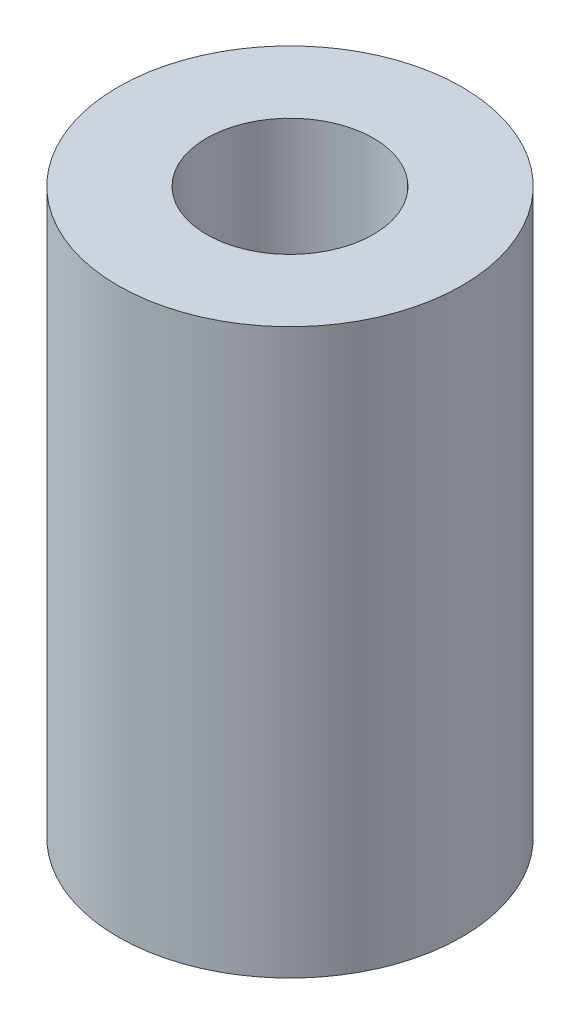
ISO-10303-21;
HEADER;
FILE_DESCRIPTION(('STEP AP214'),'2;1');
FILE_NAME('part.step','',(''),(''),'','','');
FILE_SCHEMA(('AUTOMOTIVE_DESIGN { 1 0 10303 214 1 1 1 1 }'));
ENDSEC;
DATA;
#1=APPLICATION_CONTEXT('core data for automotive mechanical design processes');
#2=APPLICATION_PROTOCOL_DEFINITION('international standard','automotive_design',2000,#1);
#3=PRODUCT_CONTEXT('',#1,'mechanical');
#4=PRODUCT('Part','Part','',(#3));
#5=PRODUCT_RELATED_PRODUCT_CATEGORY('part','',(#4));
#6=PRODUCT_DEFINITION_FORMATION('','',#4);
#7=PRODUCT_DEFINITION_CONTEXT('part definition',#1,'design');
#8=PRODUCT_DEFINITION('design','',#6,#7);
#9=PRODUCT_DEFINITION_SHAPE('','',#8);
#10=(LENGTH_UNIT() NAMED_UNIT(*) SI_UNIT(.MILLI.,.METRE.));
#11=(NAMED_UNIT(*) PLANE_ANGLE_UNIT() SI_UNIT($,.RADIAN.));
#12=(NAMED_UNIT(*) SI_UNIT($,.STERADIAN.) SOLID_ANGLE_UNIT());
#13=UNCERTAINTY_MEASURE_WITH_UNIT(LENGTH_MEASURE(1.E-05),#10,'distance_accuracy_value','');
#14=(GEOMETRIC_REPRESENTATION_CONTEXT(3) GLOBAL_UNCERTAINTY_ASSIGNED_CONTEXT((#13)) GLOBAL_UNIT_ASSIGNED_CONTEXT((#10,
#11,#12)) REPRESENTATION_CONTEXT('',''));
#15=CARTESIAN_POINT('',(0.,0.,0.));
#16=DIRECTION('',(0.,0.,1.));
#17=DIRECTION('',(1.,0.,0.));
#18=AXIS2_PLACEMENT_3D('',#15,#16,#17);
#19=CARTESIAN_POINT('',(0.,0.,0.));
#20=DIRECTION('',(0.,-1.,0.));
#21=DIRECTION('',(0.,0.,-1.));
#22=AXIS2_PLACEMENT_3D('',#19,#20,#21);
#23=CYLINDRICAL_SURFACE('',#22,3.175);
#24=CARTESIAN_POINT('',(0.,-0.326896860986548,0.));
#25=DIRECTION('',(0.,-1.,0.));
#26=DIRECTION('',(0.,0.,-1.));
#27=AXIS2_PLACEMENT_3D('',#24,#25,#26);
#28=CIRCLE('',#27,3.175);
#29=CARTESIAN_POINT('',(0.,-0.326896860986548,-3.175));
#30=VERTEX_POINT('',#29);
#31=EDGE_CURVE('E10',#30,#30,#28,.T.);
#32=ORIENTED_EDGE('',*,*,#31,.F.);
#33=EDGE_LOOP('',(#32));
#34=FACE_BOUND('',#33,.T.);
#35=CARTESIAN_POINT('',(0.,10.0871031390135,0.));
#36=DIRECTION('',(0.,-1.,0.));
#37=DIRECTION('',(0.,0.,-1.));
#38=AXIS2_PLACEMENT_3D('',#35,#36,#37);
#39=CIRCLE('',#38,3.175);
#40=CARTESIAN_POINT('',(0.,10.0871031390135,-3.175));
#41=VERTEX_POINT('',#40);
#42=EDGE_CURVE('E51',#41,#41,#39,.T.);
#43=ORIENTED_EDGE('',*,*,#42,.T.);
#44=EDGE_LOOP('',(#43));
#45=FACE_BOUND('',#44,.T.);
#46=ADVANCED_FACE('F40',(#34,#45),#23,.T.);
#47=CARTESIAN_POINT('',(-3.175,-0.326896860986548,0.));
#48=DIRECTION('',(0.,1.,0.));
#49=DIRECTION('',(0.,0.,1.));
#50=AXIS2_PLACEMENT_3D('',#47,#48,#49);
#51=PLANE('',#50);
#52=CARTESIAN_POINT('',(0.,-0.326896860986548,0.));
#53=DIRECTION('',(0.,-1.,0.));
#54=DIRECTION('',(0.,0.,-1.));
#55=AXIS2_PLACEMENT_3D('',#52,#53,#54);
#56=CIRCLE('',#55,1.54051569506726);
#57=CARTESIAN_POINT('',(0.,-0.326896860986548,-1.54051569506726));
#58=VERTEX_POINT('',#57);
#59=EDGE_CURVE('E43',#58,#58,#56,.T.);
#60=ORIENTED_EDGE('',*,*,#59,.F.);
#61=EDGE_LOOP('',(#60));
#62=FACE_BOUND('',#61,.T.);
#63=ORIENTED_EDGE('',*,*,#31,.T.);
#64=EDGE_LOOP('',(#63));
#65=FACE_BOUND('',#64,.T.);
#66=ADVANCED_FACE('F67',(#62,#65),#51,.F.);
#67=CARTESIAN_POINT('',(0.,0.,0.));
#68=DIRECTION('',(0.,-1.,0.));
#69=DIRECTION('',(0.,0.,-1.));
#70=AXIS2_PLACEMENT_3D('',#67,#68,#69);
#71=CYLINDRICAL_SURFACE('',#70,1.54051569506726);
#72=CARTESIAN_POINT('',(0.,10.0871031390135,0.));
#73=DIRECTION('',(0.,-1.,0.));
#74=DIRECTION('',(0.,0.,-1.));
#75=AXIS2_PLACEMENT_3D('',#72,#73,#74);
#76=CIRCLE('',#75,1.54051569506726);
#77=CARTESIAN_POINT('',(0.,10.0871031390135,-1.54051569506726));
#78=VERTEX_POINT('',#77);
#79=EDGE_CURVE('E50',#78,#78,#76,.T.);
#80=ORIENTED_EDGE('',*,*,#79,.F.);
#81=EDGE_LOOP('',(#80));
#82=FACE_BOUND('',#81,.T.);
#83=ORIENTED_EDGE('',*,*,#59,.T.);
#84=EDGE_LOOP('',(#83));
#85=FACE_BOUND('',#84,.T.);
#86=ADVANCED_FACE('F61',(#82,#85),#71,.F.);
#87=CARTESIAN_POINT('',(-3.175,10.0871031390135,0.));
#88=DIRECTION('',(0.,-1.,0.));
#89=DIRECTION('',(0.,0.,-1.));
#90=AXIS2_PLACEMENT_3D('',#87,#88,#89);
#91=PLANE('',#90);
#92=ORIENTED_EDGE('',*,*,#42,.F.);
#93=EDGE_LOOP('',(#92));
#94=FACE_BOUND('',#93,.T.);
#95=ORIENTED_EDGE('',*,*,#79,.T.);
#96=EDGE_LOOP('',(#95));
#97=FACE_BOUND('',#96,.T.);
#98=ADVANCED_FACE('F59',(#94,#97),#91,.F.);
#99=CLOSED_SHELL('',(#46,#66,#86,#98));
#100=MANIFOLD_SOLID_BREP('B2',#99);
#101=ADVANCED_BREP_SHAPE_REPRESENTATION('',(#18,#100),#14);
#102=SHAPE_DEFINITION_REPRESENTATION(#9,#101);
ENDSEC;
END-ISO-10303-21;
